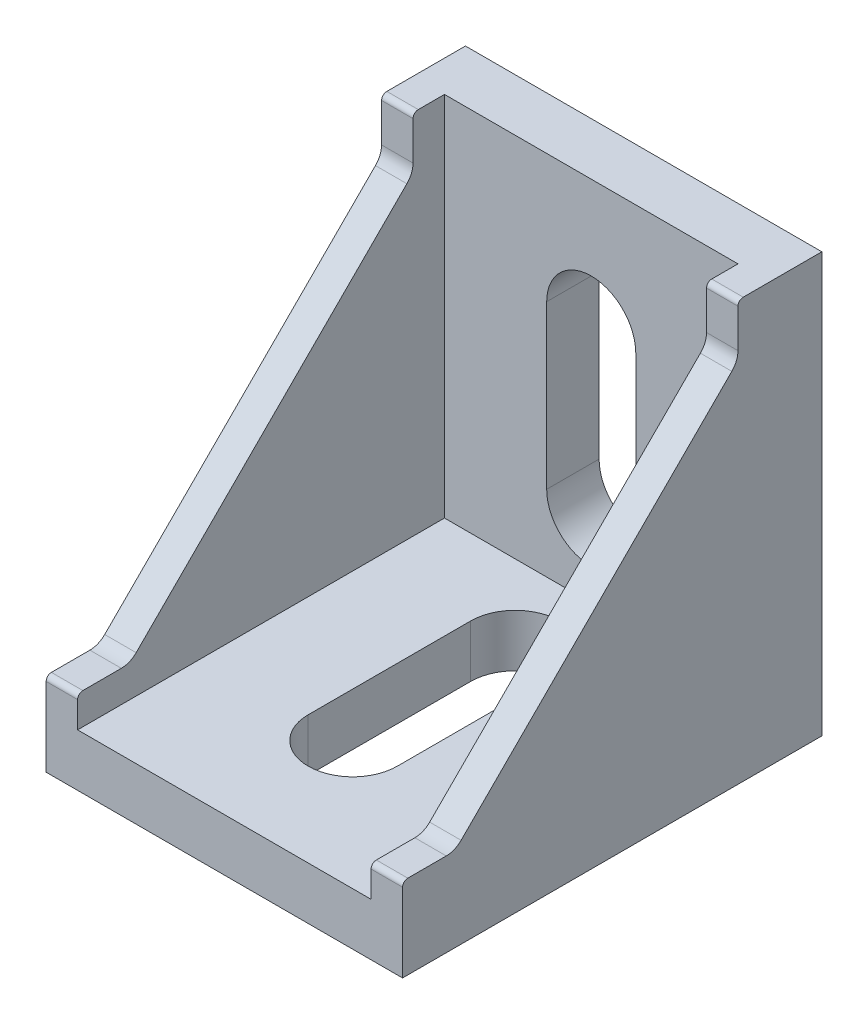
ISO-10303-21;
HEADER;
FILE_DESCRIPTION(('STEP AP214'),'2;1');
FILE_NAME('part.step','',(''),(''),'','','');
FILE_SCHEMA(('AUTOMOTIVE_DESIGN { 1 0 10303 214 1 1 1 1 }'));
ENDSEC;
DATA;
#1=APPLICATION_CONTEXT('core data for automotive mechanical design processes');
#2=APPLICATION_PROTOCOL_DEFINITION('international standard','automotive_design',2000,#1);
#3=PRODUCT_CONTEXT('',#1,'mechanical');
#4=PRODUCT('Part','Part','',(#3));
#5=PRODUCT_RELATED_PRODUCT_CATEGORY('part','',(#4));
#6=PRODUCT_DEFINITION_FORMATION('','',#4);
#7=PRODUCT_DEFINITION_CONTEXT('part definition',#1,'design');
#8=PRODUCT_DEFINITION('design','',#6,#7);
#9=PRODUCT_DEFINITION_SHAPE('','',#8);
#10=(LENGTH_UNIT() NAMED_UNIT(*) SI_UNIT(.MILLI.,.METRE.));
#11=(NAMED_UNIT(*) PLANE_ANGLE_UNIT() SI_UNIT($,.RADIAN.));
#12=(NAMED_UNIT(*) SI_UNIT($,.STERADIAN.) SOLID_ANGLE_UNIT());
#13=UNCERTAINTY_MEASURE_WITH_UNIT(LENGTH_MEASURE(1.E-05),#10,'distance_accuracy_value','');
#14=(GEOMETRIC_REPRESENTATION_CONTEXT(3) GLOBAL_UNCERTAINTY_ASSIGNED_CONTEXT((#13)) GLOBAL_UNIT_ASSIGNED_CONTEXT((#10,
#11,#12)) REPRESENTATION_CONTEXT('',''));
#15=CARTESIAN_POINT('',(0.,0.,0.));
#16=DIRECTION('',(0.,0.,1.));
#17=DIRECTION('',(1.,0.,0.));
#18=AXIS2_PLACEMENT_3D('',#15,#16,#17);
#19=CARTESIAN_POINT('',(34.,15.8284271247466,-9.99999999999973));
#20=DIRECTION('',(-1.,0.,0.));
#21=DIRECTION('',(0.,0.,-1.));
#22=AXIS2_PLACEMENT_3D('',#19,#20,#21);
#23=CYLINDRICAL_SURFACE('',#22,2.);
#24=DIRECTION('',(-1.,0.,0.));
#25=VECTOR('',#24,1.);
#26=CARTESIAN_POINT('',(34.,14.4142135623735,-11.4142135623728));
#27=LINE('',#26,#25);
#28=CARTESIAN_POINT('',(34.,14.4142135623735,-11.4142135623728));
#29=VERTEX_POINT('',#28);
#30=CARTESIAN_POINT('',(31.,14.4142135623735,-11.4142135623728));
#31=VERTEX_POINT('',#30);
#32=EDGE_CURVE('E399',#29,#31,#27,.T.);
#33=ORIENTED_EDGE('',*,*,#32,.F.);
#34=CARTESIAN_POINT('',(34.,15.8284271247466,-9.99999999999973));
#35=DIRECTION('',(1.,0.,0.));
#36=DIRECTION('',(0.,0.,-1.));
#37=AXIS2_PLACEMENT_3D('',#34,#35,#36);
#38=CIRCLE('',#37,2.);
#39=CARTESIAN_POINT('',(34.,15.8284271247465,-11.9999999999997));
#40=VERTEX_POINT('',#39);
#41=EDGE_CURVE('E336',#29,#40,#38,.T.);
#42=ORIENTED_EDGE('',*,*,#41,.T.);
#43=DIRECTION('',(-1.,0.,0.));
#44=VECTOR('',#43,1.);
#45=CARTESIAN_POINT('',(34.,15.8284271247465,-11.9999999999997));
#46=LINE('',#45,#44);
#47=CARTESIAN_POINT('',(31.,15.8284271247465,-11.9999999999997));
#48=VERTEX_POINT('',#47);
#49=EDGE_CURVE('E436',#40,#48,#46,.T.);
#50=ORIENTED_EDGE('',*,*,#49,.T.);
#51=CARTESIAN_POINT('',(31.,15.8284271247466,-9.99999999999973));
#52=DIRECTION('',(-1.,0.,0.));
#53=DIRECTION('',(0.,0.,1.));
#54=AXIS2_PLACEMENT_3D('',#51,#52,#53);
#55=CIRCLE('',#54,2.);
#56=EDGE_CURVE('E326',#31,#48,#55,.F.);
#57=ORIENTED_EDGE('',*,*,#56,.F.);
#58=EDGE_LOOP('',(#33,#42,#50,#57));
#59=FACE_BOUND('',#58,.T.);
#60=ADVANCED_FACE('F35',(#59),#23,.F.);
#61=CARTESIAN_POINT('',(34.,15.8284271247465,-11.9999999999997));
#62=DIRECTION('',(0.,0.,-1.));
#63=DIRECTION('',(0.,-1.,0.));
#64=AXIS2_PLACEMENT_3D('',#61,#62,#63);
#65=PLANE('',#64);
#66=ORIENTED_EDGE('',*,*,#49,.F.);
#67=DIRECTION('',(0.,1.,0.));
#68=VECTOR('',#67,1.);
#69=CARTESIAN_POINT('',(34.,15.8284271247465,-11.9999999999997));
#70=LINE('',#69,#68);
#71=CARTESIAN_POINT('',(34.,19.5,-12.));
#72=VERTEX_POINT('',#71);
#73=EDGE_CURVE('E339',#40,#72,#70,.T.);
#74=ORIENTED_EDGE('',*,*,#73,.T.);
#75=DIRECTION('',(-1.,0.,0.));
#76=VECTOR('',#75,1.);
#77=CARTESIAN_POINT('',(34.,19.5,-12.));
#78=LINE('',#77,#76);
#79=CARTESIAN_POINT('',(31.,19.5,-12.));
#80=VERTEX_POINT('',#79);
#81=EDGE_CURVE('E432',#72,#80,#78,.T.);
#82=ORIENTED_EDGE('',*,*,#81,.T.);
#83=DIRECTION('',(0.,1.,0.));
#84=VECTOR('',#83,1.);
#85=CARTESIAN_POINT('',(31.,15.8284271247465,-11.9999999999997));
#86=LINE('',#85,#84);
#87=EDGE_CURVE('E329',#48,#80,#86,.T.);
#88=ORIENTED_EDGE('',*,*,#87,.F.);
#89=EDGE_LOOP('',(#66,#74,#82,#88));
#90=FACE_BOUND('',#89,.T.);
#91=ADVANCED_FACE('F483',(#90),#65,.F.);
#92=CARTESIAN_POINT('',(34.,19.5,-12.5));
#93=DIRECTION('',(-1.,0.,0.));
#94=DIRECTION('',(0.,0.,-1.));
#95=AXIS2_PLACEMENT_3D('',#92,#93,#94);
#96=CYLINDRICAL_SURFACE('',#95,0.5);
#97=ORIENTED_EDGE('',*,*,#81,.F.);
#98=CARTESIAN_POINT('',(34.,19.5,-12.5));
#99=DIRECTION('',(-1.,0.,0.));
#100=DIRECTION('',(0.,0.,-1.));
#101=AXIS2_PLACEMENT_3D('',#98,#99,#100);
#102=CIRCLE('',#101,0.5);
#103=CARTESIAN_POINT('',(34.,20.,-12.5));
#104=VERTEX_POINT('',#103);
#105=EDGE_CURVE('E343',#72,#104,#102,.T.);
#106=ORIENTED_EDGE('',*,*,#105,.T.);
#107=DIRECTION('',(-1.,0.,0.));
#108=VECTOR('',#107,1.);
#109=CARTESIAN_POINT('',(34.,20.,-12.5));
#110=LINE('',#109,#108);
#111=CARTESIAN_POINT('',(31.,20.,-12.5));
#112=VERTEX_POINT('',#111);
#113=EDGE_CURVE('E428',#104,#112,#110,.T.);
#114=ORIENTED_EDGE('',*,*,#113,.T.);
#115=CARTESIAN_POINT('',(31.,19.5,-12.5));
#116=DIRECTION('',(-1.,0.,0.));
#117=DIRECTION('',(0.,0.,1.));
#118=AXIS2_PLACEMENT_3D('',#115,#116,#117);
#119=CIRCLE('',#118,0.5);
#120=EDGE_CURVE('E332',#80,#112,#119,.T.);
#121=ORIENTED_EDGE('',*,*,#120,.F.);
#122=EDGE_LOOP('',(#97,#106,#114,#121));
#123=FACE_BOUND('',#122,.T.);
#124=ADVANCED_FACE('F488',(#123),#96,.T.);
#125=CARTESIAN_POINT('',(34.,-12.5,19.5));
#126=DIRECTION('',(-1.,0.,0.));
#127=DIRECTION('',(0.,0.,-1.));
#128=AXIS2_PLACEMENT_3D('',#125,#126,#127);
#129=CYLINDRICAL_SURFACE('',#128,0.5);
#130=DIRECTION('',(-1.,0.,0.));
#131=VECTOR('',#130,1.);
#132=CARTESIAN_POINT('',(34.,-12.5,20.));
#133=LINE('',#132,#131);
#134=CARTESIAN_POINT('',(34.,-12.5,20.));
#135=VERTEX_POINT('',#134);
#136=CARTESIAN_POINT('',(31.,-12.5,20.));
#137=VERTEX_POINT('',#136);
#138=EDGE_CURVE('E415',#135,#137,#133,.T.);
#139=ORIENTED_EDGE('',*,*,#138,.F.);
#140=CARTESIAN_POINT('',(34.,-12.5,19.5));
#141=DIRECTION('',(-1.,0.,0.));
#142=DIRECTION('',(0.,0.,-1.));
#143=AXIS2_PLACEMENT_3D('',#140,#141,#142);
#144=CIRCLE('',#143,0.5);
#145=CARTESIAN_POINT('',(34.,-12.,19.5));
#146=VERTEX_POINT('',#145);
#147=EDGE_CURVE('E357',#135,#146,#144,.T.);
#148=ORIENTED_EDGE('',*,*,#147,.T.);
#149=DIRECTION('',(-1.,0.,0.));
#150=VECTOR('',#149,1.);
#151=CARTESIAN_POINT('',(34.,-12.,19.5));
#152=LINE('',#151,#150);
#153=CARTESIAN_POINT('',(31.,-12.,19.5));
#154=VERTEX_POINT('',#153);
#155=EDGE_CURVE('E411',#146,#154,#152,.T.);
#156=ORIENTED_EDGE('',*,*,#155,.T.);
#157=CARTESIAN_POINT('',(31.,-12.5,19.5));
#158=DIRECTION('',(-1.,0.,0.));
#159=DIRECTION('',(0.,0.,1.));
#160=AXIS2_PLACEMENT_3D('',#157,#158,#159);
#161=CIRCLE('',#160,0.5);
#162=EDGE_CURVE('E321',#137,#154,#161,.T.);
#163=ORIENTED_EDGE('',*,*,#162,.F.);
#164=EDGE_LOOP('',(#139,#148,#156,#163));
#165=FACE_BOUND('',#164,.T.);
#166=ADVANCED_FACE('F572',(#165),#129,.T.);
#167=CARTESIAN_POINT('',(34.,-12.,15.8284271247469));
#168=DIRECTION('',(0.,-1.,0.));
#169=DIRECTION('',(0.,0.,1.));
#170=AXIS2_PLACEMENT_3D('',#167,#168,#169);
#171=PLANE('',#170);
#172=ORIENTED_EDGE('',*,*,#155,.F.);
#173=DIRECTION('',(0.,0.,-1.));
#174=VECTOR('',#173,1.);
#175=CARTESIAN_POINT('',(34.,-12.,15.8284271247469));
#176=LINE('',#175,#174);
#177=CARTESIAN_POINT('',(34.,-12.,15.8284271247469));
#178=VERTEX_POINT('',#177);
#179=EDGE_CURVE('E360',#146,#178,#176,.T.);
#180=ORIENTED_EDGE('',*,*,#179,.T.);
#181=DIRECTION('',(-1.,0.,0.));
#182=VECTOR('',#181,1.);
#183=CARTESIAN_POINT('',(34.,-12.,15.8284271247469));
#184=LINE('',#183,#182);
#185=CARTESIAN_POINT('',(31.,-12.,15.8284271247469));
#186=VERTEX_POINT('',#185);
#187=EDGE_CURVE('E407',#178,#186,#184,.T.);
#188=ORIENTED_EDGE('',*,*,#187,.T.);
#189=DIRECTION('',(0.,0.,-1.));
#190=VECTOR('',#189,1.);
#191=CARTESIAN_POINT('',(31.,-12.,15.8284271247469));
#192=LINE('',#191,#190);
#193=EDGE_CURVE('E318',#154,#186,#192,.T.);
#194=ORIENTED_EDGE('',*,*,#193,.F.);
#195=EDGE_LOOP('',(#172,#180,#188,#194));
#196=FACE_BOUND('',#195,.T.);
#197=ADVANCED_FACE('F575',(#196),#171,.F.);
#198=CARTESIAN_POINT('',(34.,-9.99999999999998,15.8284271247468));
#199=DIRECTION('',(-1.,0.,0.));
#200=DIRECTION('',(0.,0.,-1.));
#201=AXIS2_PLACEMENT_3D('',#198,#199,#200);
#202=CYLINDRICAL_SURFACE('',#201,2.);
#203=ORIENTED_EDGE('',*,*,#187,.F.);
#204=CARTESIAN_POINT('',(34.,-9.99999999999998,15.8284271247468));
#205=DIRECTION('',(1.,0.,0.));
#206=DIRECTION('',(0.,0.,1.));
#207=AXIS2_PLACEMENT_3D('',#204,#205,#206);
#208=CIRCLE('',#207,2.);
#209=CARTESIAN_POINT('',(34.,-11.4142135623731,14.4142135623737));
#210=VERTEX_POINT('',#209);
#211=EDGE_CURVE('E363',#178,#210,#208,.T.);
#212=ORIENTED_EDGE('',*,*,#211,.T.);
#213=DIRECTION('',(-1.,0.,0.));
#214=VECTOR('',#213,1.);
#215=CARTESIAN_POINT('',(34.,-11.4142135623731,14.4142135623737));
#216=LINE('',#215,#214);
#217=CARTESIAN_POINT('',(31.,-11.4142135623731,14.4142135623737));
#218=VERTEX_POINT('',#217);
#219=EDGE_CURVE('E403',#210,#218,#216,.T.);
#220=ORIENTED_EDGE('',*,*,#219,.T.);
#221=CARTESIAN_POINT('',(31.,-9.99999999999998,15.8284271247468));
#222=DIRECTION('',(-1.,0.,0.));
#223=DIRECTION('',(0.,0.,1.));
#224=AXIS2_PLACEMENT_3D('',#221,#222,#223);
#225=CIRCLE('',#224,2.);
#226=EDGE_CURVE('E315',#186,#218,#225,.F.);
#227=ORIENTED_EDGE('',*,*,#226,.F.);
#228=EDGE_LOOP('',(#203,#212,#220,#227));
#229=FACE_BOUND('',#228,.T.);
#230=ADVANCED_FACE('F501',(#229),#202,.F.);
#231=CARTESIAN_POINT('',(34.,14.4142135623735,-11.4142135623728));
#232=DIRECTION('',(0.,-0.707106781186548,-0.707106781186547));
#233=DIRECTION('',(0.,-0.707106781186547,0.707106781186548));
#234=AXIS2_PLACEMENT_3D('',#231,#232,#233);
#235=PLANE('',#234);
#236=ORIENTED_EDGE('',*,*,#219,.F.);
#237=DIRECTION('',(0.,0.707106781186547,-0.707106781186548));
#238=VECTOR('',#237,1.);
#239=CARTESIAN_POINT('',(34.,14.4142135623735,-11.4142135623728));
#240=LINE('',#239,#238);
#241=EDGE_CURVE('E366',#210,#29,#240,.T.);
#242=ORIENTED_EDGE('',*,*,#241,.T.);
#243=ORIENTED_EDGE('',*,*,#32,.T.);
#244=DIRECTION('',(0.,0.707106781186547,-0.707106781186548));
#245=VECTOR('',#244,1.);
#246=CARTESIAN_POINT('',(31.,14.4142135623735,-11.4142135623728));
#247=LINE('',#246,#245);
#248=EDGE_CURVE('E441',#218,#31,#247,.T.);
#249=ORIENTED_EDGE('',*,*,#248,.F.);
#250=EDGE_LOOP('',(#236,#242,#243,#249));
#251=FACE_BOUND('',#250,.T.);
#252=ADVANCED_FACE('F493',(#251),#235,.F.);
#253=CARTESIAN_POINT('',(3.,15.8284271247466,-11.9999999999997));
#254=VERTEX_POINT('',#253);
#255=CARTESIAN_POINT('',(0.,15.8284271247465,-11.9999999999997));
#256=VERTEX_POINT('',#255);
#257=EDGE_CURVE('E435',#254,#256,#46,.T.);
#258=ORIENTED_EDGE('',*,*,#257,.T.);
#259=CARTESIAN_POINT('',(0.,15.8284271247466,-9.99999999999973));
#260=DIRECTION('',(1.,0.,0.));
#261=DIRECTION('',(0.,0.,-1.));
#262=AXIS2_PLACEMENT_3D('',#259,#260,#261);
#263=CIRCLE('',#262,2.);
#264=CARTESIAN_POINT('',(0.,14.4142135623735,-11.4142135623728));
#265=VERTEX_POINT('',#264);
#266=EDGE_CURVE('E335',#265,#256,#263,.T.);
#267=ORIENTED_EDGE('',*,*,#266,.F.);
#268=CARTESIAN_POINT('',(3.,14.4142135623735,-11.4142135623728));
#269=VERTEX_POINT('',#268);
#270=EDGE_CURVE('E368',#269,#265,#27,.T.);
#271=ORIENTED_EDGE('',*,*,#270,.F.);
#272=CARTESIAN_POINT('',(3.,15.8284271247466,-9.99999999999973));
#273=DIRECTION('',(1.,0.,0.));
#274=DIRECTION('',(0.,0.,-1.));
#275=AXIS2_PLACEMENT_3D('',#272,#273,#274);
#276=CIRCLE('',#275,2.);
#277=EDGE_CURVE('E308',#254,#269,#276,.F.);
#278=ORIENTED_EDGE('',*,*,#277,.F.);
#279=EDGE_LOOP('',(#258,#267,#271,#278));
#280=FACE_BOUND('',#279,.T.);
#281=ADVANCED_FACE('F37',(#280),#23,.F.);
#282=CARTESIAN_POINT('',(3.,19.5,-12.));
#283=VERTEX_POINT('',#282);
#284=CARTESIAN_POINT('',(0.,19.5,-12.));
#285=VERTEX_POINT('',#284);
#286=EDGE_CURVE('E431',#283,#285,#78,.T.);
#287=ORIENTED_EDGE('',*,*,#286,.T.);
#288=DIRECTION('',(0.,1.,0.));
#289=VECTOR('',#288,1.);
#290=CARTESIAN_POINT('',(0.,15.8284271247465,-11.9999999999997));
#291=LINE('',#290,#289);
#292=EDGE_CURVE('E371',#256,#285,#291,.T.);
#293=ORIENTED_EDGE('',*,*,#292,.F.);
#294=ORIENTED_EDGE('',*,*,#257,.F.);
#295=DIRECTION('',(0.,-1.,0.));
#296=VECTOR('',#295,1.);
#297=CARTESIAN_POINT('',(3.,15.8284271247465,-11.9999999999997));
#298=LINE('',#297,#296);
#299=EDGE_CURVE('E311',#283,#254,#298,.T.);
#300=ORIENTED_EDGE('',*,*,#299,.F.);
#301=EDGE_LOOP('',(#287,#293,#294,#300));
#302=FACE_BOUND('',#301,.T.);
#303=ADVANCED_FACE('F490',(#302),#65,.F.);
#304=CARTESIAN_POINT('',(3.,20.,-12.5));
#305=VERTEX_POINT('',#304);
#306=CARTESIAN_POINT('',(0.,20.,-12.5));
#307=VERTEX_POINT('',#306);
#308=EDGE_CURVE('E427',#305,#307,#110,.T.);
#309=ORIENTED_EDGE('',*,*,#308,.T.);
#310=CARTESIAN_POINT('',(0.,19.5,-12.5));
#311=DIRECTION('',(-1.,0.,0.));
#312=DIRECTION('',(0.,0.,-1.));
#313=AXIS2_PLACEMENT_3D('',#310,#311,#312);
#314=CIRCLE('',#313,0.5);
#315=EDGE_CURVE('E374',#285,#307,#314,.T.);
#316=ORIENTED_EDGE('',*,*,#315,.F.);
#317=ORIENTED_EDGE('',*,*,#286,.F.);
#318=CARTESIAN_POINT('',(3.,19.5,-12.5));
#319=DIRECTION('',(1.,0.,0.));
#320=DIRECTION('',(0.,0.,-1.));
#321=AXIS2_PLACEMENT_3D('',#318,#319,#320);
#322=CIRCLE('',#321,0.5);
#323=EDGE_CURVE('E313',#305,#283,#322,.T.);
#324=ORIENTED_EDGE('',*,*,#323,.F.);
#325=EDGE_LOOP('',(#309,#316,#317,#324));
#326=FACE_BOUND('',#325,.T.);
#327=ADVANCED_FACE('F499',(#326),#96,.T.);
#328=CARTESIAN_POINT('',(34.,20.,-20.));
#329=DIRECTION('',(0.,-1.,0.));
#330=DIRECTION('',(0.,0.,1.));
#331=AXIS2_PLACEMENT_3D('',#328,#329,#330);
#332=PLANE('',#331);
#333=ORIENTED_EDGE('',*,*,#113,.F.);
#334=DIRECTION('',(0.,0.,-1.));
#335=VECTOR('',#334,1.);
#336=CARTESIAN_POINT('',(34.,20.,-20.));
#337=LINE('',#336,#335);
#338=CARTESIAN_POINT('',(34.,20.,-20.));
#339=VERTEX_POINT('',#338);
#340=EDGE_CURVE('E346',#104,#339,#337,.T.);
#341=ORIENTED_EDGE('',*,*,#340,.T.);
#342=DIRECTION('',(-1.,0.,0.));
#343=VECTOR('',#342,1.);
#344=CARTESIAN_POINT('',(34.,20.,-20.));
#345=LINE('',#344,#343);
#346=CARTESIAN_POINT('',(0.,20.,-20.));
#347=VERTEX_POINT('',#346);
#348=EDGE_CURVE('E424',#339,#347,#345,.T.);
#349=ORIENTED_EDGE('',*,*,#348,.T.);
#350=DIRECTION('',(0.,0.,-1.));
#351=VECTOR('',#350,1.);
#352=CARTESIAN_POINT('',(0.,20.,-20.));
#353=LINE('',#352,#351);
#354=EDGE_CURVE('E377',#307,#347,#353,.T.);
#355=ORIENTED_EDGE('',*,*,#354,.F.);
#356=ORIENTED_EDGE('',*,*,#308,.F.);
#357=DIRECTION('',(0.,0.,-1.));
#358=VECTOR('',#357,1.);
#359=CARTESIAN_POINT('',(3.,20.,-15.));
#360=LINE('',#359,#358);
#361=CARTESIAN_POINT('',(3.,20.,-15.));
#362=VERTEX_POINT('',#361);
#363=EDGE_CURVE('E274',#305,#362,#360,.T.);
#364=ORIENTED_EDGE('',*,*,#363,.T.);
#365=DIRECTION('',(1.,0.,0.));
#366=VECTOR('',#365,1.);
#367=CARTESIAN_POINT('',(31.,20.,-15.));
#368=LINE('',#367,#366);
#369=CARTESIAN_POINT('',(31.,20.,-15.));
#370=VERTEX_POINT('',#369);
#371=EDGE_CURVE('E292',#362,#370,#368,.T.);
#372=ORIENTED_EDGE('',*,*,#371,.T.);
#373=DIRECTION('',(0.,0.,1.));
#374=VECTOR('',#373,1.);
#375=CARTESIAN_POINT('',(31.,20.,23.6124778709363));
#376=LINE('',#375,#374);
#377=EDGE_CURVE('E284',#370,#112,#376,.T.);
#378=ORIENTED_EDGE('',*,*,#377,.T.);
#379=EDGE_LOOP('',(#333,#341,#349,#355,#356,#364,#372,#378));
#380=FACE_BOUND('',#379,.T.);
#381=ADVANCED_FACE('F528',(#380),#332,.F.);
#382=CARTESIAN_POINT('',(34.,-20.,-20.));
#383=DIRECTION('',(0.,0.,1.));
#384=DIRECTION('',(-1.,0.,0.));
#385=AXIS2_PLACEMENT_3D('',#382,#383,#384);
#386=PLANE('',#385);
#387=DIRECTION('',(0.,-1.,0.));
#388=VECTOR('',#387,1.);
#389=CARTESIAN_POINT('',(12.75,7.75000000000002,-20.));
#390=LINE('',#389,#388);
#391=CARTESIAN_POINT('',(12.75,7.75000000000001,-20.));
#392=VERTEX_POINT('',#391);
#393=CARTESIAN_POINT('',(12.75,-7.74999999999998,-20.));
#394=VERTEX_POINT('',#393);
#395=EDGE_CURVE('E234',#392,#394,#390,.T.);
#396=ORIENTED_EDGE('',*,*,#395,.T.);
#397=CARTESIAN_POINT('',(17.,-7.74999999999998,-20.));
#398=DIRECTION('',(0.,0.,1.));
#399=DIRECTION('',(-1.,0.,0.));
#400=AXIS2_PLACEMENT_3D('',#397,#398,#399);
#401=CIRCLE('',#400,4.25);
#402=CARTESIAN_POINT('',(21.25,-7.74999999999998,-20.));
#403=VERTEX_POINT('',#402);
#404=EDGE_CURVE('E241',#394,#403,#401,.T.);
#405=ORIENTED_EDGE('',*,*,#404,.T.);
#406=DIRECTION('',(0.,1.,0.));
#407=VECTOR('',#406,1.);
#408=CARTESIAN_POINT('',(21.25,7.75000000000002,-20.));
#409=LINE('',#408,#407);
#410=CARTESIAN_POINT('',(21.25,7.75000000000002,-20.));
#411=VERTEX_POINT('',#410);
#412=EDGE_CURVE('E246',#403,#411,#409,.T.);
#413=ORIENTED_EDGE('',*,*,#412,.T.);
#414=CARTESIAN_POINT('',(17.,7.75000000000002,-20.));
#415=DIRECTION('',(0.,0.,1.));
#416=DIRECTION('',(1.,0.,0.));
#417=AXIS2_PLACEMENT_3D('',#414,#415,#416);
#418=CIRCLE('',#417,4.25);
#419=EDGE_CURVE('E250',#411,#392,#418,.T.);
#420=ORIENTED_EDGE('',*,*,#419,.T.);
#421=EDGE_LOOP('',(#396,#405,#413,#420));
#422=FACE_BOUND('',#421,.T.);
#423=DIRECTION('',(0.,-1.,0.));
#424=VECTOR('',#423,1.);
#425=CARTESIAN_POINT('',(0.,-20.,-20.));
#426=LINE('',#425,#424);
#427=CARTESIAN_POINT('',(0.,-20.,-20.));
#428=VERTEX_POINT('',#427);
#429=EDGE_CURVE('E380',#347,#428,#426,.T.);
#430=ORIENTED_EDGE('',*,*,#429,.F.);
#431=ORIENTED_EDGE('',*,*,#348,.F.);
#432=DIRECTION('',(0.,-1.,0.));
#433=VECTOR('',#432,1.);
#434=CARTESIAN_POINT('',(34.,-20.,-20.));
#435=LINE('',#434,#433);
#436=CARTESIAN_POINT('',(34.,-20.,-20.));
#437=VERTEX_POINT('',#436);
#438=EDGE_CURVE('E349',#339,#437,#435,.T.);
#439=ORIENTED_EDGE('',*,*,#438,.T.);
#440=DIRECTION('',(-1.,0.,0.));
#441=VECTOR('',#440,1.);
#442=CARTESIAN_POINT('',(34.,-20.,-20.));
#443=LINE('',#442,#441);
#444=EDGE_CURVE('E421',#437,#428,#443,.T.);
#445=ORIENTED_EDGE('',*,*,#444,.T.);
#446=EDGE_LOOP('',(#430,#431,#439,#445));
#447=FACE_BOUND('',#446,.T.);
#448=ADVANCED_FACE('F248',(#422,#447),#386,.F.);
#449=CARTESIAN_POINT('',(34.,-20.,-20.));
#450=DIRECTION('',(0.,1.,0.));
#451=DIRECTION('',(0.,0.,-1.));
#452=AXIS2_PLACEMENT_3D('',#449,#450,#451);
#453=PLANE('',#452);
#454=DIRECTION('',(0.,0.,1.));
#455=VECTOR('',#454,1.);
#456=CARTESIAN_POINT('',(12.75,-20.,-7.75));
#457=LINE('',#456,#455);
#458=CARTESIAN_POINT('',(12.75,-20.,-7.75));
#459=VERTEX_POINT('',#458);
#460=CARTESIAN_POINT('',(12.75,-20.,7.75000000000001));
#461=VERTEX_POINT('',#460);
#462=EDGE_CURVE('E262',#459,#461,#457,.T.);
#463=ORIENTED_EDGE('',*,*,#462,.T.);
#464=CARTESIAN_POINT('',(17.,-20.,7.75));
#465=DIRECTION('',(0.,1.,0.));
#466=DIRECTION('',(0.,0.,-1.));
#467=AXIS2_PLACEMENT_3D('',#464,#465,#466);
#468=CIRCLE('',#467,4.25);
#469=CARTESIAN_POINT('',(21.25,-20.,7.75));
#470=VERTEX_POINT('',#469);
#471=EDGE_CURVE('E265',#461,#470,#468,.T.);
#472=ORIENTED_EDGE('',*,*,#471,.T.);
#473=DIRECTION('',(0.,0.,-1.));
#474=VECTOR('',#473,1.);
#475=CARTESIAN_POINT('',(21.25,-20.,-7.75));
#476=LINE('',#475,#474);
#477=CARTESIAN_POINT('',(21.25,-20.,-7.75));
#478=VERTEX_POINT('',#477);
#479=EDGE_CURVE('E268',#470,#478,#476,.T.);
#480=ORIENTED_EDGE('',*,*,#479,.T.);
#481=CARTESIAN_POINT('',(17.,-20.,-7.75));
#482=DIRECTION('',(0.,1.,0.));
#483=DIRECTION('',(0.,0.,1.));
#484=AXIS2_PLACEMENT_3D('',#481,#482,#483);
#485=CIRCLE('',#484,4.25);
#486=EDGE_CURVE('E257',#478,#459,#485,.T.);
#487=ORIENTED_EDGE('',*,*,#486,.T.);
#488=EDGE_LOOP('',(#463,#472,#480,#487));
#489=FACE_BOUND('',#488,.T.);
#490=DIRECTION('',(0.,0.,1.));
#491=VECTOR('',#490,1.);
#492=CARTESIAN_POINT('',(0.,-20.,-20.));
#493=LINE('',#492,#491);
#494=CARTESIAN_POINT('',(0.,-20.,20.));
#495=VERTEX_POINT('',#494);
#496=EDGE_CURVE('E383',#428,#495,#493,.T.);
#497=ORIENTED_EDGE('',*,*,#496,.F.);
#498=ORIENTED_EDGE('',*,*,#444,.F.);
#499=DIRECTION('',(0.,0.,1.));
#500=VECTOR('',#499,1.);
#501=CARTESIAN_POINT('',(34.,-20.,-20.));
#502=LINE('',#501,#500);
#503=CARTESIAN_POINT('',(34.,-20.,20.));
#504=VERTEX_POINT('',#503);
#505=EDGE_CURVE('E352',#437,#504,#502,.T.);
#506=ORIENTED_EDGE('',*,*,#505,.T.);
#507=DIRECTION('',(-1.,0.,0.));
#508=VECTOR('',#507,1.);
#509=CARTESIAN_POINT('',(34.,-20.,20.));
#510=LINE('',#509,#508);
#511=EDGE_CURVE('E418',#504,#495,#510,.T.);
#512=ORIENTED_EDGE('',*,*,#511,.T.);
#513=EDGE_LOOP('',(#497,#498,#506,#512));
#514=FACE_BOUND('',#513,.T.);
#515=ADVANCED_FACE('F532',(#489,#514),#453,.F.);
#516=CARTESIAN_POINT('',(34.,-20.,20.));
#517=DIRECTION('',(0.,0.,-1.));
#518=DIRECTION('',(1.,0.,0.));
#519=AXIS2_PLACEMENT_3D('',#516,#517,#518);
#520=PLANE('',#519);
#521=DIRECTION('',(1.,0.,0.));
#522=VECTOR('',#521,1.);
#523=CARTESIAN_POINT('',(34.,-15.,20.));
#524=LINE('',#523,#522);
#525=CARTESIAN_POINT('',(3.,-15.,20.));
#526=VERTEX_POINT('',#525);
#527=CARTESIAN_POINT('',(31.,-15.,20.));
#528=VERTEX_POINT('',#527);
#529=EDGE_CURVE('E443',#526,#528,#524,.T.);
#530=ORIENTED_EDGE('',*,*,#529,.F.);
#531=DIRECTION('',(0.,-1.,0.));
#532=VECTOR('',#531,1.);
#533=CARTESIAN_POINT('',(3.,-20.,20.));
#534=LINE('',#533,#532);
#535=CARTESIAN_POINT('',(3.,-12.5,20.));
#536=VERTEX_POINT('',#535);
#537=EDGE_CURVE('E305',#536,#526,#534,.T.);
#538=ORIENTED_EDGE('',*,*,#537,.F.);
#539=CARTESIAN_POINT('',(0.,-12.5,20.));
#540=VERTEX_POINT('',#539);
#541=EDGE_CURVE('E414',#536,#540,#133,.T.);
#542=ORIENTED_EDGE('',*,*,#541,.T.);
#543=DIRECTION('',(0.,1.,0.));
#544=VECTOR('',#543,1.);
#545=CARTESIAN_POINT('',(0.,-20.,20.));
#546=LINE('',#545,#544);
#547=EDGE_CURVE('E386',#495,#540,#546,.T.);
#548=ORIENTED_EDGE('',*,*,#547,.F.);
#549=ORIENTED_EDGE('',*,*,#511,.F.);
#550=DIRECTION('',(0.,1.,0.));
#551=VECTOR('',#550,1.);
#552=CARTESIAN_POINT('',(34.,-20.,20.));
#553=LINE('',#552,#551);
#554=EDGE_CURVE('E355',#504,#135,#553,.T.);
#555=ORIENTED_EDGE('',*,*,#554,.T.);
#556=ORIENTED_EDGE('',*,*,#138,.T.);
#557=DIRECTION('',(0.,1.,0.));
#558=VECTOR('',#557,1.);
#559=CARTESIAN_POINT('',(31.,-20.,20.));
#560=LINE('',#559,#558);
#561=EDGE_CURVE('E324',#528,#137,#560,.T.);
#562=ORIENTED_EDGE('',*,*,#561,.F.);
#563=EDGE_LOOP('',(#530,#538,#542,#548,#549,#555,#556,#562));
#564=FACE_BOUND('',#563,.T.);
#565=ADVANCED_FACE('F536',(#564),#520,.F.);
#566=CARTESIAN_POINT('',(3.,-12.,19.5));
#567=VERTEX_POINT('',#566);
#568=CARTESIAN_POINT('',(0.,-12.,19.5));
#569=VERTEX_POINT('',#568);
#570=EDGE_CURVE('E410',#567,#569,#152,.T.);
#571=ORIENTED_EDGE('',*,*,#570,.T.);
#572=CARTESIAN_POINT('',(0.,-12.5,19.5));
#573=DIRECTION('',(-1.,0.,0.));
#574=DIRECTION('',(0.,0.,-1.));
#575=AXIS2_PLACEMENT_3D('',#572,#573,#574);
#576=CIRCLE('',#575,0.5);
#577=EDGE_CURVE('E389',#540,#569,#576,.T.);
#578=ORIENTED_EDGE('',*,*,#577,.F.);
#579=ORIENTED_EDGE('',*,*,#541,.F.);
#580=CARTESIAN_POINT('',(3.,-12.5,19.5));
#581=DIRECTION('',(1.,0.,0.));
#582=DIRECTION('',(0.,0.,-1.));
#583=AXIS2_PLACEMENT_3D('',#580,#581,#582);
#584=CIRCLE('',#583,0.5);
#585=EDGE_CURVE('E303',#567,#536,#584,.T.);
#586=ORIENTED_EDGE('',*,*,#585,.F.);
#587=EDGE_LOOP('',(#571,#578,#579,#586));
#588=FACE_BOUND('',#587,.T.);
#589=ADVANCED_FACE('F546',(#588),#129,.T.);
#590=CARTESIAN_POINT('',(3.,-12.,15.8284271247469));
#591=VERTEX_POINT('',#590);
#592=CARTESIAN_POINT('',(0.,-12.,15.8284271247469));
#593=VERTEX_POINT('',#592);
#594=EDGE_CURVE('E406',#591,#593,#184,.T.);
#595=ORIENTED_EDGE('',*,*,#594,.T.);
#596=DIRECTION('',(0.,0.,-1.));
#597=VECTOR('',#596,1.);
#598=CARTESIAN_POINT('',(0.,-12.,15.8284271247469));
#599=LINE('',#598,#597);
#600=EDGE_CURVE('E392',#569,#593,#599,.T.);
#601=ORIENTED_EDGE('',*,*,#600,.F.);
#602=ORIENTED_EDGE('',*,*,#570,.F.);
#603=DIRECTION('',(0.,0.,1.));
#604=VECTOR('',#603,1.);
#605=CARTESIAN_POINT('',(3.,-12.,15.8284271247469));
#606=LINE('',#605,#604);
#607=EDGE_CURVE('E301',#591,#567,#606,.T.);
#608=ORIENTED_EDGE('',*,*,#607,.F.);
#609=EDGE_LOOP('',(#595,#601,#602,#608));
#610=FACE_BOUND('',#609,.T.);
#611=ADVANCED_FACE('F549',(#610),#171,.F.);
#612=CARTESIAN_POINT('',(3.,-11.4142135623731,14.4142135623737));
#613=VERTEX_POINT('',#612);
#614=CARTESIAN_POINT('',(0.,-11.4142135623731,14.4142135623737));
#615=VERTEX_POINT('',#614);
#616=EDGE_CURVE('E402',#613,#615,#216,.T.);
#617=ORIENTED_EDGE('',*,*,#616,.T.);
#618=CARTESIAN_POINT('',(0.,-9.99999999999998,15.8284271247468));
#619=DIRECTION('',(1.,0.,0.));
#620=DIRECTION('',(0.,0.,1.));
#621=AXIS2_PLACEMENT_3D('',#618,#619,#620);
#622=CIRCLE('',#621,2.);
#623=EDGE_CURVE('E395',#593,#615,#622,.T.);
#624=ORIENTED_EDGE('',*,*,#623,.F.);
#625=ORIENTED_EDGE('',*,*,#594,.F.);
#626=CARTESIAN_POINT('',(3.,-9.99999999999998,15.8284271247468));
#627=DIRECTION('',(1.,0.,0.));
#628=DIRECTION('',(0.,0.,-1.));
#629=AXIS2_PLACEMENT_3D('',#626,#627,#628);
#630=CIRCLE('',#629,2.);
#631=EDGE_CURVE('E298',#613,#591,#630,.F.);
#632=ORIENTED_EDGE('',*,*,#631,.F.);
#633=EDGE_LOOP('',(#617,#624,#625,#632));
#634=FACE_BOUND('',#633,.T.);
#635=ADVANCED_FACE('F552',(#634),#202,.F.);
#636=ORIENTED_EDGE('',*,*,#270,.T.);
#637=DIRECTION('',(0.,0.707106781186547,-0.707106781186548));
#638=VECTOR('',#637,1.);
#639=CARTESIAN_POINT('',(0.,14.4142135623735,-11.4142135623728));
#640=LINE('',#639,#638);
#641=EDGE_CURVE('E340',#615,#265,#640,.T.);
#642=ORIENTED_EDGE('',*,*,#641,.F.);
#643=ORIENTED_EDGE('',*,*,#616,.F.);
#644=DIRECTION('',(0.,-0.707106781186547,0.707106781186548));
#645=VECTOR('',#644,1.);
#646=CARTESIAN_POINT('',(3.,14.4142135623735,-11.4142135623728));
#647=LINE('',#646,#645);
#648=EDGE_CURVE('E439',#269,#613,#647,.T.);
#649=ORIENTED_EDGE('',*,*,#648,.F.);
#650=EDGE_LOOP('',(#636,#642,#643,#649));
#651=FACE_BOUND('',#650,.T.);
#652=ADVANCED_FACE('F504',(#651),#235,.F.);
#653=CARTESIAN_POINT('',(34.,15.8284271247466,-9.99999999999973));
#654=DIRECTION('',(-1.,0.,0.));
#655=DIRECTION('',(0.,0.,-1.));
#656=AXIS2_PLACEMENT_3D('',#653,#654,#655);
#657=PLANE('',#656);
#658=ORIENTED_EDGE('',*,*,#41,.F.);
#659=ORIENTED_EDGE('',*,*,#241,.F.);
#660=ORIENTED_EDGE('',*,*,#211,.F.);
#661=ORIENTED_EDGE('',*,*,#179,.F.);
#662=ORIENTED_EDGE('',*,*,#147,.F.);
#663=ORIENTED_EDGE('',*,*,#554,.F.);
#664=ORIENTED_EDGE('',*,*,#505,.F.);
#665=ORIENTED_EDGE('',*,*,#438,.F.);
#666=ORIENTED_EDGE('',*,*,#340,.F.);
#667=ORIENTED_EDGE('',*,*,#105,.F.);
#668=ORIENTED_EDGE('',*,*,#73,.F.);
#669=EDGE_LOOP('',(#658,#659,#660,#661,#662,#663,#664,#665,#666,#667,#668));
#670=FACE_BOUND('',#669,.T.);
#671=ADVANCED_FACE('F566',(#670),#657,.F.);
#672=CARTESIAN_POINT('',(0.,15.8284271247466,-9.99999999999973));
#673=DIRECTION('',(-1.,0.,0.));
#674=DIRECTION('',(0.,0.,-1.));
#675=AXIS2_PLACEMENT_3D('',#672,#673,#674);
#676=PLANE('',#675);
#677=ORIENTED_EDGE('',*,*,#266,.T.);
#678=ORIENTED_EDGE('',*,*,#292,.T.);
#679=ORIENTED_EDGE('',*,*,#315,.T.);
#680=ORIENTED_EDGE('',*,*,#354,.T.);
#681=ORIENTED_EDGE('',*,*,#429,.T.);
#682=ORIENTED_EDGE('',*,*,#496,.T.);
#683=ORIENTED_EDGE('',*,*,#547,.T.);
#684=ORIENTED_EDGE('',*,*,#577,.T.);
#685=ORIENTED_EDGE('',*,*,#600,.T.);
#686=ORIENTED_EDGE('',*,*,#623,.T.);
#687=ORIENTED_EDGE('',*,*,#641,.T.);
#688=EDGE_LOOP('',(#677,#678,#679,#680,#681,#682,#683,#684,#685,#686,#687));
#689=FACE_BOUND('',#688,.T.);
#690=ADVANCED_FACE('F514',(#689),#676,.T.);
#691=CARTESIAN_POINT('',(0.,-15.,0.));
#692=DIRECTION('',(0.,-1.,0.));
#693=DIRECTION('',(0.,0.,1.));
#694=AXIS2_PLACEMENT_3D('',#691,#692,#693);
#695=PLANE('',#694);
#696=DIRECTION('',(0.,0.,-1.));
#697=VECTOR('',#696,1.);
#698=CARTESIAN_POINT('',(21.25,-15.,0.));
#699=LINE('',#698,#697);
#700=CARTESIAN_POINT('',(21.25,-15.,7.75));
#701=VERTEX_POINT('',#700);
#702=CARTESIAN_POINT('',(21.25,-15.,-7.75));
#703=VERTEX_POINT('',#702);
#704=EDGE_CURVE('E452',#701,#703,#699,.T.);
#705=ORIENTED_EDGE('',*,*,#704,.F.);
#706=CARTESIAN_POINT('',(17.,-15.,7.75));
#707=DIRECTION('',(0.,1.,0.));
#708=DIRECTION('',(0.,0.,1.));
#709=AXIS2_PLACEMENT_3D('',#706,#707,#708);
#710=CIRCLE('',#709,4.25);
#711=CARTESIAN_POINT('',(12.75,-15.,7.75000000000001));
#712=VERTEX_POINT('',#711);
#713=EDGE_CURVE('E449',#712,#701,#710,.T.);
#714=ORIENTED_EDGE('',*,*,#713,.F.);
#715=DIRECTION('',(0.,0.,1.));
#716=VECTOR('',#715,1.);
#717=CARTESIAN_POINT('',(12.75,-15.,0.));
#718=LINE('',#717,#716);
#719=CARTESIAN_POINT('',(12.75,-15.,-7.75));
#720=VERTEX_POINT('',#719);
#721=EDGE_CURVE('E446',#720,#712,#718,.T.);
#722=ORIENTED_EDGE('',*,*,#721,.F.);
#723=CARTESIAN_POINT('',(17.,-15.,-7.75));
#724=DIRECTION('',(0.,1.,0.));
#725=DIRECTION('',(0.,0.,1.));
#726=AXIS2_PLACEMENT_3D('',#723,#724,#725);
#727=CIRCLE('',#726,4.25);
#728=EDGE_CURVE('E455',#703,#720,#727,.T.);
#729=ORIENTED_EDGE('',*,*,#728,.F.);
#730=EDGE_LOOP('',(#705,#714,#722,#729));
#731=FACE_BOUND('',#730,.T.);
#732=DIRECTION('',(0.,0.,-1.));
#733=VECTOR('',#732,1.);
#734=CARTESIAN_POINT('',(3.,-15.,-12.));
#735=LINE('',#734,#733);
#736=CARTESIAN_POINT('',(3.,-15.,-15.));
#737=VERTEX_POINT('',#736);
#738=EDGE_CURVE('E280',#526,#737,#735,.T.);
#739=ORIENTED_EDGE('',*,*,#738,.F.);
#740=ORIENTED_EDGE('',*,*,#529,.T.);
#741=DIRECTION('',(0.,0.,1.));
#742=VECTOR('',#741,1.);
#743=CARTESIAN_POINT('',(31.,-15.,-15.));
#744=LINE('',#743,#742);
#745=CARTESIAN_POINT('',(31.,-15.,-15.));
#746=VERTEX_POINT('',#745);
#747=EDGE_CURVE('E287',#746,#528,#744,.T.);
#748=ORIENTED_EDGE('',*,*,#747,.F.);
#749=DIRECTION('',(1.,0.,0.));
#750=VECTOR('',#749,1.);
#751=CARTESIAN_POINT('',(31.,-15.,-15.));
#752=LINE('',#751,#750);
#753=EDGE_CURVE('E283',#737,#746,#752,.T.);
#754=ORIENTED_EDGE('',*,*,#753,.F.);
#755=EDGE_LOOP('',(#739,#740,#748,#754));
#756=FACE_BOUND('',#755,.T.);
#757=ADVANCED_FACE('F556',(#731,#756),#695,.F.);
#758=CARTESIAN_POINT('',(31.,-15.,23.6124778709363));
#759=DIRECTION('',(1.,0.,0.));
#760=DIRECTION('',(0.,0.,1.));
#761=AXIS2_PLACEMENT_3D('',#758,#759,#760);
#762=PLANE('',#761);
#763=ORIENTED_EDGE('',*,*,#87,.T.);
#764=ORIENTED_EDGE('',*,*,#120,.T.);
#765=ORIENTED_EDGE('',*,*,#377,.F.);
#766=DIRECTION('',(0.,1.,0.));
#767=VECTOR('',#766,1.);
#768=CARTESIAN_POINT('',(31.,-15.,-15.));
#769=LINE('',#768,#767);
#770=EDGE_CURVE('E296',#746,#370,#769,.T.);
#771=ORIENTED_EDGE('',*,*,#770,.F.);
#772=ORIENTED_EDGE('',*,*,#747,.T.);
#773=ORIENTED_EDGE('',*,*,#561,.T.);
#774=ORIENTED_EDGE('',*,*,#162,.T.);
#775=ORIENTED_EDGE('',*,*,#193,.T.);
#776=ORIENTED_EDGE('',*,*,#226,.T.);
#777=ORIENTED_EDGE('',*,*,#248,.T.);
#778=ORIENTED_EDGE('',*,*,#56,.T.);
#779=EDGE_LOOP('',(#763,#764,#765,#771,#772,#773,#774,#775,#776,#777,#778));
#780=FACE_BOUND('',#779,.T.);
#781=ADVANCED_FACE('F561',(#780),#762,.F.);
#782=CARTESIAN_POINT('',(3.,-15.,-15.));
#783=DIRECTION('',(-1.,0.,0.));
#784=DIRECTION('',(0.,0.,-1.));
#785=AXIS2_PLACEMENT_3D('',#782,#783,#784);
#786=PLANE('',#785);
#787=ORIENTED_EDGE('',*,*,#363,.F.);
#788=ORIENTED_EDGE('',*,*,#323,.T.);
#789=ORIENTED_EDGE('',*,*,#299,.T.);
#790=ORIENTED_EDGE('',*,*,#277,.T.);
#791=ORIENTED_EDGE('',*,*,#648,.T.);
#792=ORIENTED_EDGE('',*,*,#631,.T.);
#793=ORIENTED_EDGE('',*,*,#607,.T.);
#794=ORIENTED_EDGE('',*,*,#585,.T.);
#795=ORIENTED_EDGE('',*,*,#537,.T.);
#796=ORIENTED_EDGE('',*,*,#738,.T.);
#797=DIRECTION('',(0.,1.,0.));
#798=VECTOR('',#797,1.);
#799=CARTESIAN_POINT('',(3.,-15.,-15.));
#800=LINE('',#799,#798);
#801=EDGE_CURVE('E289',#737,#362,#800,.T.);
#802=ORIENTED_EDGE('',*,*,#801,.T.);
#803=EDGE_LOOP('',(#787,#788,#789,#790,#791,#792,#793,#794,#795,#796,#802));
#804=FACE_BOUND('',#803,.T.);
#805=ADVANCED_FACE('F521',(#804),#786,.F.);
#806=CARTESIAN_POINT('',(31.,-15.,-15.));
#807=DIRECTION('',(0.,0.,-1.));
#808=DIRECTION('',(1.,0.,0.));
#809=AXIS2_PLACEMENT_3D('',#806,#807,#808);
#810=PLANE('',#809);
#811=DIRECTION('',(0.,1.,0.));
#812=VECTOR('',#811,1.);
#813=CARTESIAN_POINT('',(21.25,-15.,-15.));
#814=LINE('',#813,#812);
#815=CARTESIAN_POINT('',(21.25,-7.74999999999998,-15.));
#816=VERTEX_POINT('',#815);
#817=CARTESIAN_POINT('',(21.25,7.75000000000002,-15.));
#818=VERTEX_POINT('',#817);
#819=EDGE_CURVE('E43',#816,#818,#814,.T.);
#820=ORIENTED_EDGE('',*,*,#819,.F.);
#821=CARTESIAN_POINT('',(17.,-7.74999999999998,-15.));
#822=DIRECTION('',(0.,0.,1.));
#823=DIRECTION('',(1.,0.,0.));
#824=AXIS2_PLACEMENT_3D('',#821,#822,#823);
#825=CIRCLE('',#824,4.25);
#826=CARTESIAN_POINT('',(12.75,-7.74999999999998,-15.));
#827=VERTEX_POINT('',#826);
#828=EDGE_CURVE('E459',#827,#816,#825,.T.);
#829=ORIENTED_EDGE('',*,*,#828,.F.);
#830=DIRECTION('',(0.,-1.,0.));
#831=VECTOR('',#830,1.);
#832=CARTESIAN_POINT('',(12.75,-15.,-15.));
#833=LINE('',#832,#831);
#834=CARTESIAN_POINT('',(12.75,7.75000000000002,-15.));
#835=VERTEX_POINT('',#834);
#836=EDGE_CURVE('E236',#835,#827,#833,.T.);
#837=ORIENTED_EDGE('',*,*,#836,.F.);
#838=CARTESIAN_POINT('',(17.,7.75000000000002,-15.));
#839=DIRECTION('',(0.,0.,1.));
#840=DIRECTION('',(1.,0.,0.));
#841=AXIS2_PLACEMENT_3D('',#838,#839,#840);
#842=CIRCLE('',#841,4.25);
#843=EDGE_CURVE('E11',#818,#835,#842,.T.);
#844=ORIENTED_EDGE('',*,*,#843,.F.);
#845=EDGE_LOOP('',(#820,#829,#837,#844));
#846=FACE_BOUND('',#845,.T.);
#847=ORIENTED_EDGE('',*,*,#371,.F.);
#848=ORIENTED_EDGE('',*,*,#801,.F.);
#849=ORIENTED_EDGE('',*,*,#753,.T.);
#850=ORIENTED_EDGE('',*,*,#770,.T.);
#851=EDGE_LOOP('',(#847,#848,#849,#850));
#852=FACE_BOUND('',#851,.T.);
#853=ADVANCED_FACE('F466',(#846,#852),#810,.F.);
#854=CARTESIAN_POINT('',(17.,15.,-7.75));
#855=DIRECTION('',(0.,-1.,0.));
#856=DIRECTION('',(0.,0.,1.));
#857=AXIS2_PLACEMENT_3D('',#854,#855,#856);
#858=CYLINDRICAL_SURFACE('',#857,4.25);
#859=DIRECTION('',(0.,-1.,0.));
#860=VECTOR('',#859,1.);
#861=CARTESIAN_POINT('',(21.25,15.,-7.75));
#862=LINE('',#861,#860);
#863=EDGE_CURVE('E272',#703,#478,#862,.T.);
#864=ORIENTED_EDGE('',*,*,#863,.F.);
#865=ORIENTED_EDGE('',*,*,#728,.T.);
#866=DIRECTION('',(0.,-1.,0.));
#867=VECTOR('',#866,1.);
#868=CARTESIAN_POINT('',(12.75,15.,-7.75));
#869=LINE('',#868,#867);
#870=EDGE_CURVE('E271',#720,#459,#869,.T.);
#871=ORIENTED_EDGE('',*,*,#870,.T.);
#872=ORIENTED_EDGE('',*,*,#486,.F.);
#873=EDGE_LOOP('',(#864,#865,#871,#872));
#874=FACE_BOUND('',#873,.T.);
#875=ADVANCED_FACE('F722',(#874),#858,.F.);
#876=CARTESIAN_POINT('',(21.25,15.,-7.75));
#877=DIRECTION('',(1.,0.,0.));
#878=DIRECTION('',(0.,0.,1.));
#879=AXIS2_PLACEMENT_3D('',#876,#877,#878);
#880=PLANE('',#879);
#881=DIRECTION('',(0.,-1.,0.));
#882=VECTOR('',#881,1.);
#883=CARTESIAN_POINT('',(21.25,15.,7.75));
#884=LINE('',#883,#882);
#885=EDGE_CURVE('E275',#701,#470,#884,.T.);
#886=ORIENTED_EDGE('',*,*,#885,.F.);
#887=ORIENTED_EDGE('',*,*,#704,.T.);
#888=ORIENTED_EDGE('',*,*,#863,.T.);
#889=ORIENTED_EDGE('',*,*,#479,.F.);
#890=EDGE_LOOP('',(#886,#887,#888,#889));
#891=FACE_BOUND('',#890,.T.);
#892=ADVANCED_FACE('F730',(#891),#880,.F.);
#893=CARTESIAN_POINT('',(17.,15.,7.75));
#894=DIRECTION('',(0.,-1.,0.));
#895=DIRECTION('',(0.,0.,1.));
#896=AXIS2_PLACEMENT_3D('',#893,#894,#895);
#897=CYLINDRICAL_SURFACE('',#896,4.25);
#898=DIRECTION('',(0.,-1.,0.));
#899=VECTOR('',#898,1.);
#900=CARTESIAN_POINT('',(12.75,15.,7.75000000000001));
#901=LINE('',#900,#899);
#902=EDGE_CURVE('E277',#712,#461,#901,.T.);
#903=ORIENTED_EDGE('',*,*,#902,.F.);
#904=ORIENTED_EDGE('',*,*,#713,.T.);
#905=ORIENTED_EDGE('',*,*,#885,.T.);
#906=ORIENTED_EDGE('',*,*,#471,.F.);
#907=EDGE_LOOP('',(#903,#904,#905,#906));
#908=FACE_BOUND('',#907,.T.);
#909=ADVANCED_FACE('F477',(#908),#897,.F.);
#910=CARTESIAN_POINT('',(12.75,15.,-7.75));
#911=DIRECTION('',(-1.,0.,0.));
#912=DIRECTION('',(0.,0.,-1.));
#913=AXIS2_PLACEMENT_3D('',#910,#911,#912);
#914=PLANE('',#913);
#915=ORIENTED_EDGE('',*,*,#870,.F.);
#916=ORIENTED_EDGE('',*,*,#721,.T.);
#917=ORIENTED_EDGE('',*,*,#902,.T.);
#918=ORIENTED_EDGE('',*,*,#462,.F.);
#919=EDGE_LOOP('',(#915,#916,#917,#918));
#920=FACE_BOUND('',#919,.T.);
#921=ADVANCED_FACE('F470',(#920),#914,.F.);
#922=CARTESIAN_POINT('',(17.,7.75000000000002,15.));
#923=DIRECTION('',(0.,0.,-1.));
#924=DIRECTION('',(1.,0.,0.));
#925=AXIS2_PLACEMENT_3D('',#922,#923,#924);
#926=CYLINDRICAL_SURFACE('',#925,4.25);
#927=DIRECTION('',(0.,0.,-1.));
#928=VECTOR('',#927,1.);
#929=CARTESIAN_POINT('',(21.25,7.75000000000002,15.));
#930=LINE('',#929,#928);
#931=EDGE_CURVE('E255',#818,#411,#930,.T.);
#932=ORIENTED_EDGE('',*,*,#931,.F.);
#933=ORIENTED_EDGE('',*,*,#843,.T.);
#934=DIRECTION('',(0.,0.,-1.));
#935=VECTOR('',#934,1.);
#936=CARTESIAN_POINT('',(12.75,7.75000000000002,15.));
#937=LINE('',#936,#935);
#938=EDGE_CURVE('E49',#835,#392,#937,.T.);
#939=ORIENTED_EDGE('',*,*,#938,.T.);
#940=ORIENTED_EDGE('',*,*,#419,.F.);
#941=EDGE_LOOP('',(#932,#933,#939,#940));
#942=FACE_BOUND('',#941,.T.);
#943=ADVANCED_FACE('F468',(#942),#926,.F.);
#944=CARTESIAN_POINT('',(21.25,7.75000000000002,15.));
#945=DIRECTION('',(1.,0.,0.));
#946=DIRECTION('',(0.,0.,1.));
#947=AXIS2_PLACEMENT_3D('',#944,#945,#946);
#948=PLANE('',#947);
#949=DIRECTION('',(0.,0.,-1.));
#950=VECTOR('',#949,1.);
#951=CARTESIAN_POINT('',(21.25,-7.74999999999998,15.));
#952=LINE('',#951,#950);
#953=EDGE_CURVE('E238',#816,#403,#952,.T.);
#954=ORIENTED_EDGE('',*,*,#953,.F.);
#955=ORIENTED_EDGE('',*,*,#819,.T.);
#956=ORIENTED_EDGE('',*,*,#931,.T.);
#957=ORIENTED_EDGE('',*,*,#412,.F.);
#958=EDGE_LOOP('',(#954,#955,#956,#957));
#959=FACE_BOUND('',#958,.T.);
#960=ADVANCED_FACE('F463',(#959),#948,.F.);
#961=CARTESIAN_POINT('',(17.,-7.74999999999998,15.));
#962=DIRECTION('',(0.,0.,-1.));
#963=DIRECTION('',(1.,0.,0.));
#964=AXIS2_PLACEMENT_3D('',#961,#962,#963);
#965=CYLINDRICAL_SURFACE('',#964,4.25);
#966=DIRECTION('',(0.,0.,-1.));
#967=VECTOR('',#966,1.);
#968=CARTESIAN_POINT('',(12.75,-7.74999999999998,15.));
#969=LINE('',#968,#967);
#970=EDGE_CURVE('E57',#827,#394,#969,.T.);
#971=ORIENTED_EDGE('',*,*,#970,.F.);
#972=ORIENTED_EDGE('',*,*,#828,.T.);
#973=ORIENTED_EDGE('',*,*,#953,.T.);
#974=ORIENTED_EDGE('',*,*,#404,.F.);
#975=EDGE_LOOP('',(#971,#972,#973,#974));
#976=FACE_BOUND('',#975,.T.);
#977=ADVANCED_FACE('F242',(#976),#965,.F.);
#978=CARTESIAN_POINT('',(12.75,7.75000000000002,15.));
#979=DIRECTION('',(-1.,0.,0.));
#980=DIRECTION('',(0.,0.,-1.));
#981=AXIS2_PLACEMENT_3D('',#978,#979,#980);
#982=PLANE('',#981);
#983=ORIENTED_EDGE('',*,*,#938,.F.);
#984=ORIENTED_EDGE('',*,*,#836,.T.);
#985=ORIENTED_EDGE('',*,*,#970,.T.);
#986=ORIENTED_EDGE('',*,*,#395,.F.);
#987=EDGE_LOOP('',(#983,#984,#985,#986));
#988=FACE_BOUND('',#987,.T.);
#989=ADVANCED_FACE('F232',(#988),#982,.F.);
#990=CLOSED_SHELL('',(#60,#91,#124,#166,#197,#230,#252,#281,#303,#327,#381,#448,#515,#565,#589,
#611,#635,#652,#671,#690,#757,#781,#805,#853,#875,#892,#909,#921,#943,#960,#977,#989));
#991=MANIFOLD_SOLID_BREP('B2',#990);
#992=ADVANCED_BREP_SHAPE_REPRESENTATION('',(#18,#991),#14);
#993=SHAPE_DEFINITION_REPRESENTATION(#9,#992);
ENDSEC;
END-ISO-10303-21;
